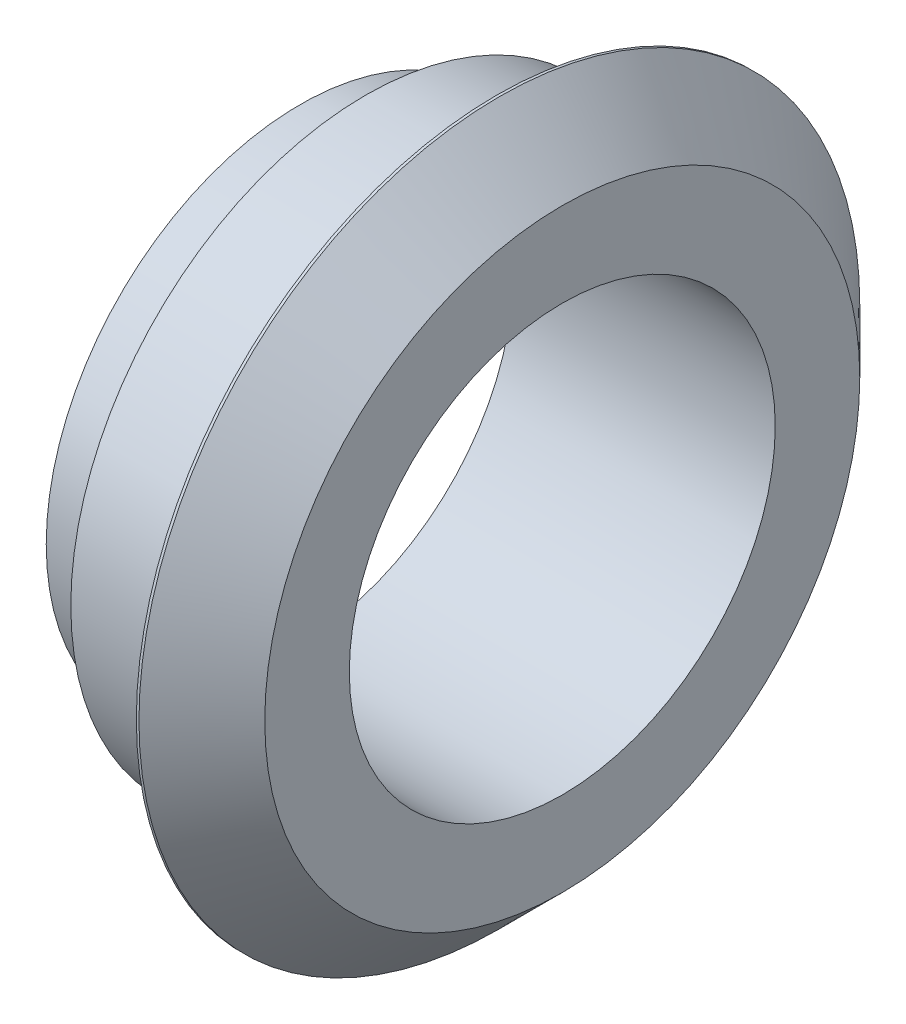
ISO-10303-21;
HEADER;
FILE_DESCRIPTION(('STEP AP214'),'2;1');
FILE_NAME('part.step','',(''),(''),'','','');
FILE_SCHEMA(('AUTOMOTIVE_DESIGN { 1 0 10303 214 1 1 1 1 }'));
ENDSEC;
DATA;
#1=APPLICATION_CONTEXT('core data for automotive mechanical design processes');
#2=APPLICATION_PROTOCOL_DEFINITION('international standard','automotive_design',2000,#1);
#3=PRODUCT_CONTEXT('',#1,'mechanical');
#4=PRODUCT('Part','Part','',(#3));
#5=PRODUCT_RELATED_PRODUCT_CATEGORY('part','',(#4));
#6=PRODUCT_DEFINITION_FORMATION('','',#4);
#7=PRODUCT_DEFINITION_CONTEXT('part definition',#1,'design');
#8=PRODUCT_DEFINITION('design','',#6,#7);
#9=PRODUCT_DEFINITION_SHAPE('','',#8);
#10=(LENGTH_UNIT() NAMED_UNIT(*) SI_UNIT(.MILLI.,.METRE.));
#11=(NAMED_UNIT(*) PLANE_ANGLE_UNIT() SI_UNIT($,.RADIAN.));
#12=(NAMED_UNIT(*) SI_UNIT($,.STERADIAN.) SOLID_ANGLE_UNIT());
#13=UNCERTAINTY_MEASURE_WITH_UNIT(LENGTH_MEASURE(1.E-05),#10,'distance_accuracy_value','');
#14=(GEOMETRIC_REPRESENTATION_CONTEXT(3) GLOBAL_UNCERTAINTY_ASSIGNED_CONTEXT((#13)) GLOBAL_UNIT_ASSIGNED_CONTEXT((#10,
#11,#12)) REPRESENTATION_CONTEXT('',''));
#15=CARTESIAN_POINT('',(0.,0.,0.));
#16=DIRECTION('',(0.,0.,1.));
#17=DIRECTION('',(1.,0.,0.));
#18=AXIS2_PLACEMENT_3D('',#15,#16,#17);
#19=CARTESIAN_POINT('',(-5.91819999999999,0.,-228.336665427124));
#20=DIRECTION('',(-1.,0.,0.));
#21=DIRECTION('',(0.,0.,1.));
#22=AXIS2_PLACEMENT_3D('',#19,#20,#21);
#23=PLANE('',#22);
#24=CARTESIAN_POINT('',(-5.91819999999999,0.,-216.033540427124));
#25=DIRECTION('',(1.,0.,0.));
#26=DIRECTION('',(0.,0.,-1.));
#27=AXIS2_PLACEMENT_3D('',#24,#25,#26);
#28=CIRCLE('',#27,12.303125);
#29=CARTESIAN_POINT('',(-5.91819999999999,0.,-228.336665427124));
#30=VERTEX_POINT('',#29);
#31=EDGE_CURVE('E10',#30,#30,#28,.T.);
#32=ORIENTED_EDGE('',*,*,#31,.F.);
#33=EDGE_LOOP('',(#32));
#34=FACE_BOUND('',#33,.T.);
#35=CARTESIAN_POINT('',(-5.91819999999998,0.,-216.033540427124));
#36=DIRECTION('',(-1.,0.,0.));
#37=DIRECTION('',(0.,0.,1.));
#38=AXIS2_PLACEMENT_3D('',#35,#36,#37);
#39=CIRCLE('',#38,10.31875);
#40=CARTESIAN_POINT('',(-5.91819999999998,0.,-205.714790427124));
#41=VERTEX_POINT('',#40);
#42=EDGE_CURVE('E58',#41,#41,#39,.T.);
#43=ORIENTED_EDGE('',*,*,#42,.F.);
#44=EDGE_LOOP('',(#43));
#45=FACE_BOUND('',#44,.T.);
#46=ADVANCED_FACE('F41',(#34,#45),#23,.T.);
#47=CARTESIAN_POINT('',(-2.74319999999998,0.,-230.321040427124));
#48=DIRECTION('',(-1.,0.,0.));
#49=DIRECTION('',(0.,0.,1.));
#50=AXIS2_PLACEMENT_3D('',#47,#48,#49);
#51=PLANE('',#50);
#52=CARTESIAN_POINT('',(-2.74319999999999,0.,-216.033540427124));
#53=DIRECTION('',(-1.,0.,0.));
#54=DIRECTION('',(0.,0.,1.));
#55=AXIS2_PLACEMENT_3D('',#52,#53,#54);
#56=CIRCLE('',#55,14.2875);
#57=CARTESIAN_POINT('',(-2.74319999999998,0.,-230.321040427124));
#58=VERTEX_POINT('',#57);
#59=EDGE_CURVE('E45',#58,#58,#56,.T.);
#60=ORIENTED_EDGE('',*,*,#59,.T.);
#61=EDGE_LOOP('',(#60));
#62=FACE_BOUND('',#61,.T.);
#63=CARTESIAN_POINT('',(-2.74319999999998,0.,-216.033540427124));
#64=DIRECTION('',(1.,0.,0.));
#65=DIRECTION('',(0.,0.,-1.));
#66=AXIS2_PLACEMENT_3D('',#63,#64,#65);
#67=CIRCLE('',#66,12.303125);
#68=CARTESIAN_POINT('',(-2.74319999999998,0.,-228.336665427124));
#69=VERTEX_POINT('',#68);
#70=EDGE_CURVE('E49',#69,#69,#67,.T.);
#71=ORIENTED_EDGE('',*,*,#70,.T.);
#72=EDGE_LOOP('',(#71));
#73=FACE_BOUND('',#72,.T.);
#74=ADVANCED_FACE('F72',(#62,#73),#51,.T.);
#75=CARTESIAN_POINT('',(-5.8839094316067,0.,-216.033540427124));
#76=DIRECTION('',(1.,0.,0.));
#77=DIRECTION('',(0.,0.,-1.));
#78=AXIS2_PLACEMENT_3D('',#75,#76,#77);
#79=CYLINDRICAL_SURFACE('',#78,12.303125);
#80=ORIENTED_EDGE('',*,*,#70,.F.);
#81=EDGE_LOOP('',(#80));
#82=FACE_BOUND('',#81,.T.);
#83=ORIENTED_EDGE('',*,*,#31,.T.);
#84=EDGE_LOOP('',(#83));
#85=FACE_BOUND('',#84,.T.);
#86=ADVANCED_FACE('F86',(#82,#85),#79,.T.);
#87=CARTESIAN_POINT('',(6.78180000000002,0.,-216.033540427124));
#88=DIRECTION('',(-1.,0.,0.));
#89=DIRECTION('',(0.,0.,1.));
#90=AXIS2_PLACEMENT_3D('',#87,#88,#89);
#91=CYLINDRICAL_SURFACE('',#90,10.31875);
#92=CARTESIAN_POINT('',(6.78180000000002,0.,-216.033540427124));
#93=DIRECTION('',(1.,0.,0.));
#94=DIRECTION('',(0.,0.,-1.));
#95=AXIS2_PLACEMENT_3D('',#92,#93,#94);
#96=CIRCLE('',#95,10.31875);
#97=CARTESIAN_POINT('',(6.78180000000002,0.,-226.352290427124));
#98=VERTEX_POINT('',#97);
#99=EDGE_CURVE('E54',#98,#98,#96,.T.);
#100=ORIENTED_EDGE('',*,*,#99,.T.);
#101=EDGE_LOOP('',(#100));
#102=FACE_BOUND('',#101,.T.);
#103=ORIENTED_EDGE('',*,*,#42,.T.);
#104=EDGE_LOOP('',(#103));
#105=FACE_BOUND('',#104,.T.);
#106=ADVANCED_FACE('F43',(#102,#105),#91,.F.);
#107=CARTESIAN_POINT('',(-52.6793525448111,0.,-216.033540427124));
#108=DIRECTION('',(1.,0.,0.));
#109=DIRECTION('',(0.,0.,-1.));
#110=AXIS2_PLACEMENT_3D('',#107,#108,#109);
#111=CYLINDRICAL_SURFACE('',#110,14.2875);
#112=CARTESIAN_POINT('',(3.60680000000002,0.,-216.033540427124));
#113=DIRECTION('',(1.,0.,0.));
#114=DIRECTION('',(0.,0.,-1.));
#115=AXIS2_PLACEMENT_3D('',#112,#113,#114);
#116=CIRCLE('',#115,14.2875);
#117=CARTESIAN_POINT('',(3.60680000000001,0.,-230.321040427124));
#118=VERTEX_POINT('',#117);
#119=EDGE_CURVE('E117',#118,#118,#116,.F.);
#120=CARTESIAN_POINT('',(3.60680000000001,0.,-230.321040427124));
#121=CARTESIAN_POINT('',(3.54065416666668,0.,-230.321040427124));
#122=CARTESIAN_POINT('',(3.47450833333335,0.,-230.321040427124));
#123=CARTESIAN_POINT('',(3.34221666666668,0.,-230.321040427124));
#124=CARTESIAN_POINT('',(3.27607083333335,0.,-230.321040427124));
#125=CARTESIAN_POINT('',(3.14377916666668,0.,-230.321040427124));
#126=CARTESIAN_POINT('',(3.07763333333335,0.,-230.321040427124));
#127=CARTESIAN_POINT('',(2.94534166666668,0.,-230.321040427124));
#128=CARTESIAN_POINT('',(2.87919583333335,0.,-230.321040427124));
#129=CARTESIAN_POINT('',(2.74690416666668,0.,-230.321040427124));
#130=CARTESIAN_POINT('',(2.68075833333335,0.,-230.321040427124));
#131=CARTESIAN_POINT('',(2.54846666666668,0.,-230.321040427124));
#132=CARTESIAN_POINT('',(2.48232083333335,0.,-230.321040427124));
#133=CARTESIAN_POINT('',(2.35002916666668,0.,-230.321040427124));
#134=CARTESIAN_POINT('',(2.28388333333335,0.,-230.321040427124));
#135=CARTESIAN_POINT('',(2.15159166666668,0.,-230.321040427124));
#136=CARTESIAN_POINT('',(2.08544583333335,0.,-230.321040427124));
#137=CARTESIAN_POINT('',(1.95315416666668,0.,-230.321040427124));
#138=CARTESIAN_POINT('',(1.88700833333335,0.,-230.321040427124));
#139=CARTESIAN_POINT('',(1.75471666666668,0.,-230.321040427124));
#140=CARTESIAN_POINT('',(1.68857083333335,0.,-230.321040427124));
#141=CARTESIAN_POINT('',(1.55627916666668,0.,-230.321040427124));
#142=CARTESIAN_POINT('',(1.49013333333335,0.,-230.321040427124));
#143=CARTESIAN_POINT('',(1.35784166666668,0.,-230.321040427124));
#144=CARTESIAN_POINT('',(1.29169583333335,0.,-230.321040427124));
#145=CARTESIAN_POINT('',(1.15940416666668,0.,-230.321040427124));
#146=CARTESIAN_POINT('',(1.09325833333335,0.,-230.321040427124));
#147=CARTESIAN_POINT('',(0.960966666666683,0.,-230.321040427124));
#148=CARTESIAN_POINT('',(0.894820833333349,0.,-230.321040427124));
#149=CARTESIAN_POINT('',(0.762529166666683,0.,-230.321040427124));
#150=CARTESIAN_POINT('',(0.696383333333351,0.,-230.321040427124));
#151=CARTESIAN_POINT('',(0.564091666666685,0.,-230.321040427124));
#152=CARTESIAN_POINT('',(0.497945833333351,0.,-230.321040427124));
#153=CARTESIAN_POINT('',(0.365654166666683,0.,-230.321040427124));
#154=CARTESIAN_POINT('',(0.299508333333349,0.,-230.321040427124));
#155=CARTESIAN_POINT('',(0.167216666666683,0.,-230.321040427124));
#156=CARTESIAN_POINT('',(0.101070833333351,0.,-230.321040427124));
#157=CARTESIAN_POINT('',(-0.0312208333333152,0.,-230.321040427124));
#158=CARTESIAN_POINT('',(-0.0973666666666493,0.,-230.321040427124));
#159=CARTESIAN_POINT('',(-0.229658333333315,0.,-230.321040427124));
#160=CARTESIAN_POINT('',(-0.295804166666647,0.,-230.321040427124));
#161=CARTESIAN_POINT('',(-0.428095833333313,0.,-230.321040427124));
#162=CARTESIAN_POINT('',(-0.494241666666647,0.,-230.321040427124));
#163=CARTESIAN_POINT('',(-0.626533333333316,0.,-230.321040427124));
#164=CARTESIAN_POINT('',(-0.69267916666665,0.,-230.321040427124));
#165=CARTESIAN_POINT('',(-0.824970833333316,0.,-230.321040427124));
#166=CARTESIAN_POINT('',(-0.891116666666647,0.,-230.321040427124));
#167=CARTESIAN_POINT('',(-1.02340833333331,0.,-230.321040427124));
#168=CARTESIAN_POINT('',(-1.08955416666665,0.,-230.321040427124));
#169=CARTESIAN_POINT('',(-1.22184583333332,0.,-230.321040427124));
#170=CARTESIAN_POINT('',(-1.28799166666665,0.,-230.321040427124));
#171=CARTESIAN_POINT('',(-1.42028333333332,0.,-230.321040427124));
#172=CARTESIAN_POINT('',(-1.48642916666665,0.,-230.321040427124));
#173=CARTESIAN_POINT('',(-1.61872083333331,0.,-230.321040427124));
#174=CARTESIAN_POINT('',(-1.68486666666665,0.,-230.321040427124));
#175=CARTESIAN_POINT('',(-1.81715833333332,0.,-230.321040427124));
#176=CARTESIAN_POINT('',(-1.88330416666665,0.,-230.321040427124));
#177=CARTESIAN_POINT('',(-2.01559583333332,0.,-230.321040427124));
#178=CARTESIAN_POINT('',(-2.08174166666665,0.,-230.321040427124));
#179=CARTESIAN_POINT('',(-2.21403333333331,0.,-230.321040427124));
#180=CARTESIAN_POINT('',(-2.28017916666665,0.,-230.321040427124));
#181=CARTESIAN_POINT('',(-2.41247083333331,0.,-230.321040427124));
#182=CARTESIAN_POINT('',(-2.47861666666665,0.,-230.321040427124));
#183=CARTESIAN_POINT('',(-2.61090833333331,0.,-230.321040427124));
#184=CARTESIAN_POINT('',(-2.67705416666665,0.,-230.321040427124));
#185=CARTESIAN_POINT('',(-2.74319999999998,0.,-230.321040427124));
#186=B_SPLINE_CURVE_WITH_KNOTS('',3,(#120,#121,#122,#123,#124,#125,#126,#127,#128,#129,#130,
#131,#132,#133,#134,#135,#136,#137,#138,#139,#140,#141,#142,#143,#144,#145,#146,#147,#148,#149,
#150,#151,#152,#153,#154,#155,#156,#157,#158,#159,#160,#161,#162,#163,#164,#165,#166,#167,#168,
#169,#170,#171,#172,#173,#174,#175,#176,#177,#178,#179,#180,#181,#182,#183,#184,#185),
.UNSPECIFIED.,.F.,.F.,(4,2,2,2,2,2,2,2,2,2,2,2,2,2,2,2,2,2,2,2,2,2,2,2,2,2,2,2,2,2,2,2,4),(0.,
0.198437500000002,0.396874999999998,0.5953125,0.793749999999996,0.992187499999998,1.190625,
1.3890625,1.5875,1.7859375,1.984375,2.1828125,2.38125,2.5796875,2.778125,2.97656249999999,3.175,
3.3734375,3.571875,3.7703125,3.96874999999999,4.1671875,4.365625,4.56406249999999,4.7625,
4.9609375,5.15937499999999,5.3578125,5.55625,5.75468749999999,5.953125,6.15156249999999,
6.34999999999999),.UNSPECIFIED.);
#187=EDGE_CURVE('BSEAM75',#118,#58,#186,.T.);
#188=ORIENTED_EDGE('',*,*,#119,.T.);
#189=ORIENTED_EDGE('',*,*,#59,.F.);
#190=ORIENTED_EDGE('',*,*,#187,.T.);
#191=ORIENTED_EDGE('',*,*,#187,.F.);
#192=EDGE_LOOP('',(#188,#190,#189,#191));
#193=FACE_BOUND('',#192,.T.);
#194=ADVANCED_FACE('F75',(#193),#111,.T.);
#195=CARTESIAN_POINT('',(3.60680000000002,0.,-216.033540427124));
#196=DIRECTION('',(1.,0.,0.));
#197=DIRECTION('',(0.,0.,-1.));
#198=AXIS2_PLACEMENT_3D('',#195,#196,#197);
#199=PLANE('',#198);
#200=CARTESIAN_POINT('',(3.60680000000002,0.,-216.033540427124));
#201=DIRECTION('',(1.,0.,0.));
#202=DIRECTION('',(0.,0.,-1.));
#203=AXIS2_PLACEMENT_3D('',#200,#201,#202);
#204=CIRCLE('',#203,17.4625);
#205=CARTESIAN_POINT('',(3.60680000000002,0.,-233.496040427124));
#206=VERTEX_POINT('',#205);
#207=EDGE_CURVE('E119',#206,#206,#204,.T.);
#208=ORIENTED_EDGE('',*,*,#207,.F.);
#209=EDGE_LOOP('',(#208));
#210=FACE_BOUND('',#209,.T.);
#211=ORIENTED_EDGE('',*,*,#119,.F.);
#212=EDGE_LOOP('',(#211));
#213=FACE_BOUND('',#212,.T.);
#214=ADVANCED_FACE('F77',(#210,#213),#199,.F.);
#215=CARTESIAN_POINT('',(6.78180000000002,0.,-216.033540427124));
#216=DIRECTION('',(1.,0.,0.));
#217=DIRECTION('',(0.,0.,-1.));
#218=AXIS2_PLACEMENT_3D('',#215,#216,#217);
#219=PLANE('',#218);
#220=CARTESIAN_POINT('',(6.78180000000002,0.,-216.033540427124));
#221=DIRECTION('',(1.,0.,0.));
#222=DIRECTION('',(0.,0.,-1.));
#223=AXIS2_PLACEMENT_3D('',#220,#221,#222);
#224=CIRCLE('',#223,14.4145);
#225=CARTESIAN_POINT('',(6.78180000000002,0.,-230.448040427123));
#226=VERTEX_POINT('',#225);
#227=EDGE_CURVE('E64',#226,#226,#224,.T.);
#228=ORIENTED_EDGE('',*,*,#227,.T.);
#229=EDGE_LOOP('',(#228));
#230=FACE_BOUND('',#229,.T.);
#231=ORIENTED_EDGE('',*,*,#99,.F.);
#232=EDGE_LOOP('',(#231));
#233=FACE_BOUND('',#232,.T.);
#234=ADVANCED_FACE('F83',(#230,#233),#219,.T.);
#235=CARTESIAN_POINT('',(6.78180000000002,0.,-216.033540427124));
#236=DIRECTION('',(-1.,0.,0.));
#237=DIRECTION('',(0.,0.,1.));
#238=AXIS2_PLACEMENT_3D('',#235,#236,#237);
#239=CYLINDRICAL_SURFACE('',#238,17.4625);
#240=CARTESIAN_POINT('',(3.7338,0.,-216.033540427124));
#241=DIRECTION('',(1.,0.,0.));
#242=DIRECTION('',(0.,0.,-1.));
#243=AXIS2_PLACEMENT_3D('',#240,#241,#242);
#244=CIRCLE('',#243,17.4625);
#245=CARTESIAN_POINT('',(3.7338,0.,-233.496040427124));
#246=VERTEX_POINT('',#245);
#247=EDGE_CURVE('E60',#246,#246,#244,.F.);
#248=ORIENTED_EDGE('',*,*,#247,.T.);
#249=EDGE_LOOP('',(#248));
#250=FACE_BOUND('',#249,.T.);
#251=ORIENTED_EDGE('',*,*,#207,.T.);
#252=EDGE_LOOP('',(#251));
#253=FACE_BOUND('',#252,.T.);
#254=ADVANCED_FACE('F100',(#250,#253),#239,.T.);
#255=CARTESIAN_POINT('',(6.78180000000002,0.,-216.033540427124));
#256=DIRECTION('',(-1.,0.,0.));
#257=DIRECTION('',(0.,0.,1.));
#258=AXIS2_PLACEMENT_3D('',#255,#256,#257);
#259=CONICAL_SURFACE('',#258,14.4145,0.78539816339745);
#260=ORIENTED_EDGE('',*,*,#247,.F.);
#261=EDGE_LOOP('',(#260));
#262=FACE_BOUND('',#261,.T.);
#263=ORIENTED_EDGE('',*,*,#227,.F.);
#264=EDGE_LOOP('',(#263));
#265=FACE_BOUND('',#264,.T.);
#266=ADVANCED_FACE('F93',(#262,#265),#259,.T.);
#267=CLOSED_SHELL('',(#46,#74,#86,#106,#194,#214,#234,#254,#266));
#268=MANIFOLD_SOLID_BREP('B2',#267);
#269=ADVANCED_BREP_SHAPE_REPRESENTATION('',(#18,#268),#14);
#270=SHAPE_DEFINITION_REPRESENTATION(#9,#269);
ENDSEC;
END-ISO-10303-21;
